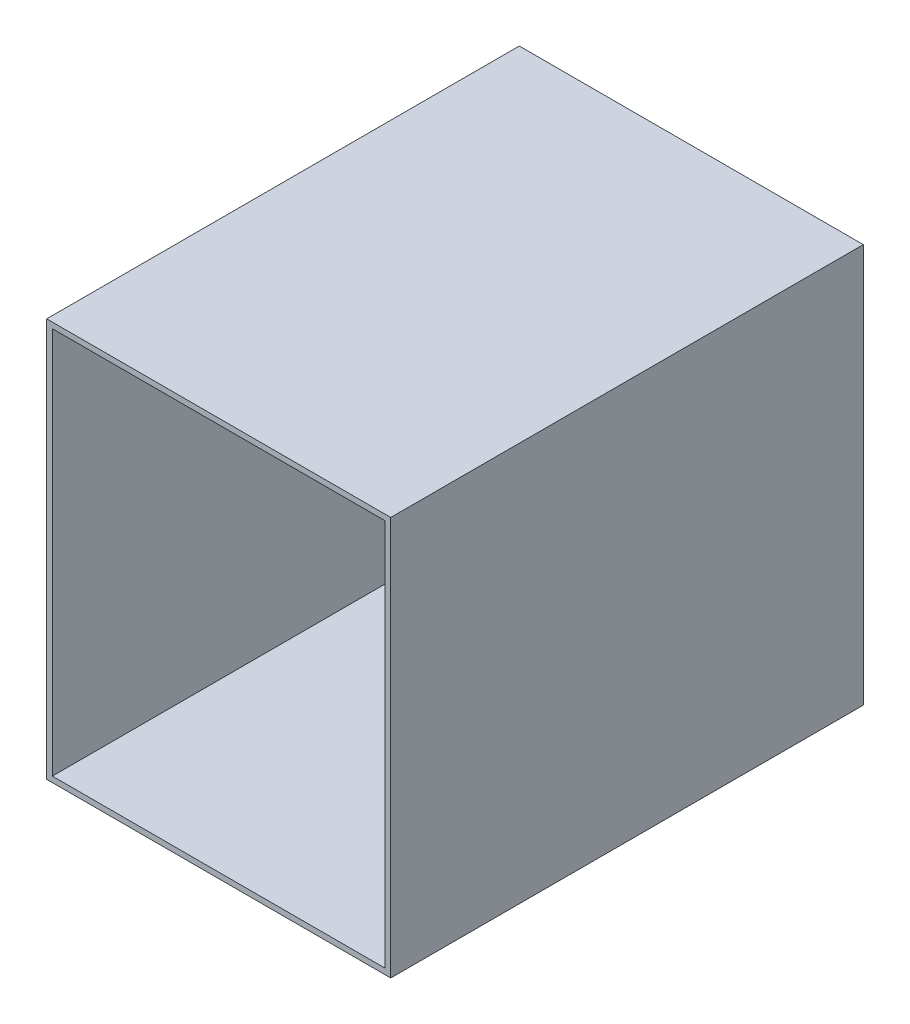
ISO-10303-21;
HEADER;
FILE_DESCRIPTION(('STEP AP214'),'2;1');
FILE_NAME('part.step','',(''),(''),'','','');
FILE_SCHEMA(('AUTOMOTIVE_DESIGN { 1 0 10303 214 1 1 1 1 }'));
ENDSEC;
DATA;
#1=APPLICATION_CONTEXT('core data for automotive mechanical design processes');
#2=APPLICATION_PROTOCOL_DEFINITION('international standard','automotive_design',2000,#1);
#3=PRODUCT_CONTEXT('',#1,'mechanical');
#4=PRODUCT('Part','Part','',(#3));
#5=PRODUCT_RELATED_PRODUCT_CATEGORY('part','',(#4));
#6=PRODUCT_DEFINITION_FORMATION('','',#4);
#7=PRODUCT_DEFINITION_CONTEXT('part definition',#1,'design');
#8=PRODUCT_DEFINITION('design','',#6,#7);
#9=PRODUCT_DEFINITION_SHAPE('','',#8);
#10=(LENGTH_UNIT() NAMED_UNIT(*) SI_UNIT(.MILLI.,.METRE.));
#11=(NAMED_UNIT(*) PLANE_ANGLE_UNIT() SI_UNIT($,.RADIAN.));
#12=(NAMED_UNIT(*) SI_UNIT($,.STERADIAN.) SOLID_ANGLE_UNIT());
#13=UNCERTAINTY_MEASURE_WITH_UNIT(LENGTH_MEASURE(1.E-05),#10,'distance_accuracy_value','');
#14=(GEOMETRIC_REPRESENTATION_CONTEXT(3) GLOBAL_UNCERTAINTY_ASSIGNED_CONTEXT((#13)) GLOBAL_UNIT_ASSIGNED_CONTEXT((#10,
#11,#12)) REPRESENTATION_CONTEXT('',''));
#15=CARTESIAN_POINT('',(0.,0.,0.));
#16=DIRECTION('',(0.,0.,1.));
#17=DIRECTION('',(1.,0.,0.));
#18=AXIS2_PLACEMENT_3D('',#15,#16,#17);
#19=CARTESIAN_POINT('',(0.,211.,250.));
#20=DIRECTION('',(1.,0.,0.));
#21=DIRECTION('',(0.,0.,-1.));
#22=AXIS2_PLACEMENT_3D('',#19,#20,#21);
#23=PLANE('',#22);
#24=DIRECTION('',(0.,-1.,0.));
#25=VECTOR('',#24,1.);
#26=CARTESIAN_POINT('',(0.,211.,0.));
#27=LINE('',#26,#25);
#28=CARTESIAN_POINT('',(0.,211.,0.));
#29=VERTEX_POINT('',#28);
#30=CARTESIAN_POINT('',(0.,0.,0.));
#31=VERTEX_POINT('',#30);
#32=EDGE_CURVE('E153',#29,#31,#27,.T.);
#33=ORIENTED_EDGE('',*,*,#32,.T.);
#34=DIRECTION('',(0.,0.,-1.));
#35=VECTOR('',#34,1.);
#36=CARTESIAN_POINT('',(0.,0.,250.));
#37=LINE('',#36,#35);
#38=CARTESIAN_POINT('',(0.,0.,250.));
#39=VERTEX_POINT('',#38);
#40=EDGE_CURVE('E11',#39,#31,#37,.T.);
#41=ORIENTED_EDGE('',*,*,#40,.F.);
#42=DIRECTION('',(0.,-1.,0.));
#43=VECTOR('',#42,1.);
#44=CARTESIAN_POINT('',(0.,211.,250.));
#45=LINE('',#44,#43);
#46=CARTESIAN_POINT('',(0.,211.,250.));
#47=VERTEX_POINT('',#46);
#48=EDGE_CURVE('E146',#47,#39,#45,.T.);
#49=ORIENTED_EDGE('',*,*,#48,.F.);
#50=DIRECTION('',(0.,0.,-1.));
#51=VECTOR('',#50,1.);
#52=CARTESIAN_POINT('',(0.,211.,250.));
#53=LINE('',#52,#51);
#54=EDGE_CURVE('E152',#47,#29,#53,.T.);
#55=ORIENTED_EDGE('',*,*,#54,.T.);
#56=EDGE_LOOP('',(#33,#41,#49,#55));
#57=FACE_BOUND('',#56,.T.);
#58=ADVANCED_FACE('F39',(#57),#23,.F.);
#59=CARTESIAN_POINT('',(0.,0.,250.));
#60=DIRECTION('',(0.,1.,0.));
#61=DIRECTION('',(0.,0.,1.));
#62=AXIS2_PLACEMENT_3D('',#59,#60,#61);
#63=PLANE('',#62);
#64=DIRECTION('',(1.,0.,0.));
#65=VECTOR('',#64,1.);
#66=CARTESIAN_POINT('',(0.,0.,0.));
#67=LINE('',#66,#65);
#68=CARTESIAN_POINT('',(182.,0.,0.));
#69=VERTEX_POINT('',#68);
#70=EDGE_CURVE('E156',#31,#69,#67,.T.);
#71=ORIENTED_EDGE('',*,*,#70,.T.);
#72=DIRECTION('',(0.,0.,-1.));
#73=VECTOR('',#72,1.);
#74=CARTESIAN_POINT('',(182.,0.,250.));
#75=LINE('',#74,#73);
#76=CARTESIAN_POINT('',(182.,0.,250.));
#77=VERTEX_POINT('',#76);
#78=EDGE_CURVE('E46',#77,#69,#75,.T.);
#79=ORIENTED_EDGE('',*,*,#78,.F.);
#80=DIRECTION('',(1.,0.,0.));
#81=VECTOR('',#80,1.);
#82=CARTESIAN_POINT('',(0.,0.,250.));
#83=LINE('',#82,#81);
#84=EDGE_CURVE('E90',#39,#77,#83,.T.);
#85=ORIENTED_EDGE('',*,*,#84,.F.);
#86=ORIENTED_EDGE('',*,*,#40,.T.);
#87=EDGE_LOOP('',(#71,#79,#85,#86));
#88=FACE_BOUND('',#87,.T.);
#89=ADVANCED_FACE('F185',(#88),#63,.F.);
#90=CARTESIAN_POINT('',(182.,0.,250.));
#91=DIRECTION('',(-1.,0.,0.));
#92=DIRECTION('',(0.,0.,1.));
#93=AXIS2_PLACEMENT_3D('',#90,#91,#92);
#94=PLANE('',#93);
#95=DIRECTION('',(0.,1.,0.));
#96=VECTOR('',#95,1.);
#97=CARTESIAN_POINT('',(182.,0.,0.));
#98=LINE('',#97,#96);
#99=CARTESIAN_POINT('',(182.,211.,0.));
#100=VERTEX_POINT('',#99);
#101=EDGE_CURVE('E158',#69,#100,#98,.T.);
#102=ORIENTED_EDGE('',*,*,#101,.T.);
#103=DIRECTION('',(0.,0.,-1.));
#104=VECTOR('',#103,1.);
#105=CARTESIAN_POINT('',(182.,211.,250.));
#106=LINE('',#105,#104);
#107=CARTESIAN_POINT('',(182.,211.,250.));
#108=VERTEX_POINT('',#107);
#109=EDGE_CURVE('E162',#108,#100,#106,.T.);
#110=ORIENTED_EDGE('',*,*,#109,.F.);
#111=DIRECTION('',(0.,1.,0.));
#112=VECTOR('',#111,1.);
#113=CARTESIAN_POINT('',(182.,0.,250.));
#114=LINE('',#113,#112);
#115=EDGE_CURVE('E149',#77,#108,#114,.T.);
#116=ORIENTED_EDGE('',*,*,#115,.F.);
#117=ORIENTED_EDGE('',*,*,#78,.T.);
#118=EDGE_LOOP('',(#102,#110,#116,#117));
#119=FACE_BOUND('',#118,.T.);
#120=ADVANCED_FACE('F167',(#119),#94,.F.);
#121=CARTESIAN_POINT('',(182.,211.,250.));
#122=DIRECTION('',(0.,-1.,0.));
#123=DIRECTION('',(0.,0.,-1.));
#124=AXIS2_PLACEMENT_3D('',#121,#122,#123);
#125=PLANE('',#124);
#126=DIRECTION('',(-1.,0.,0.));
#127=VECTOR('',#126,1.);
#128=CARTESIAN_POINT('',(182.,211.,0.));
#129=LINE('',#128,#127);
#130=EDGE_CURVE('E83',#100,#29,#129,.T.);
#131=ORIENTED_EDGE('',*,*,#130,.T.);
#132=ORIENTED_EDGE('',*,*,#54,.F.);
#133=DIRECTION('',(-1.,0.,0.));
#134=VECTOR('',#133,1.);
#135=CARTESIAN_POINT('',(182.,211.,250.));
#136=LINE('',#135,#134);
#137=EDGE_CURVE('E62',#108,#47,#136,.T.);
#138=ORIENTED_EDGE('',*,*,#137,.F.);
#139=ORIENTED_EDGE('',*,*,#109,.T.);
#140=EDGE_LOOP('',(#131,#132,#138,#139));
#141=FACE_BOUND('',#140,.T.);
#142=ADVANCED_FACE('F175',(#141),#125,.F.);
#143=CARTESIAN_POINT('',(0.,0.,250.));
#144=DIRECTION('',(0.,0.,1.));
#145=DIRECTION('',(1.,0.,0.));
#146=AXIS2_PLACEMENT_3D('',#143,#144,#145);
#147=PLANE('',#146);
#148=DIRECTION('',(0.,-1.,0.));
#149=VECTOR('',#148,1.);
#150=CARTESIAN_POINT('',(3.,211.,250.));
#151=LINE('',#150,#149);
#152=CARTESIAN_POINT('',(3.,208.,250.));
#153=VERTEX_POINT('',#152);
#154=CARTESIAN_POINT('',(3.,3.,250.));
#155=VERTEX_POINT('',#154);
#156=EDGE_CURVE('E135',#153,#155,#151,.T.);
#157=ORIENTED_EDGE('',*,*,#156,.F.);
#158=DIRECTION('',(-1.,0.,0.));
#159=VECTOR('',#158,1.);
#160=CARTESIAN_POINT('',(182.,208.,250.));
#161=LINE('',#160,#159);
#162=CARTESIAN_POINT('',(179.,208.,250.));
#163=VERTEX_POINT('',#162);
#164=EDGE_CURVE('E144',#163,#153,#161,.T.);
#165=ORIENTED_EDGE('',*,*,#164,.F.);
#166=DIRECTION('',(0.,1.,0.));
#167=VECTOR('',#166,1.);
#168=CARTESIAN_POINT('',(179.,0.,250.));
#169=LINE('',#168,#167);
#170=CARTESIAN_POINT('',(179.,3.,250.));
#171=VERTEX_POINT('',#170);
#172=EDGE_CURVE('E142',#171,#163,#169,.T.);
#173=ORIENTED_EDGE('',*,*,#172,.F.);
#174=DIRECTION('',(1.,0.,0.));
#175=VECTOR('',#174,1.);
#176=CARTESIAN_POINT('',(0.,3.,250.));
#177=LINE('',#176,#175);
#178=EDGE_CURVE('E127',#155,#171,#177,.T.);
#179=ORIENTED_EDGE('',*,*,#178,.F.);
#180=EDGE_LOOP('',(#157,#165,#173,#179));
#181=FACE_BOUND('',#180,.T.);
#182=ORIENTED_EDGE('',*,*,#48,.T.);
#183=ORIENTED_EDGE('',*,*,#84,.T.);
#184=ORIENTED_EDGE('',*,*,#115,.T.);
#185=ORIENTED_EDGE('',*,*,#137,.T.);
#186=EDGE_LOOP('',(#182,#183,#184,#185));
#187=FACE_BOUND('',#186,.T.);
#188=ADVANCED_FACE('F177',(#181,#187),#147,.T.);
#189=CARTESIAN_POINT('',(0.,0.,0.));
#190=DIRECTION('',(0.,0.,1.));
#191=DIRECTION('',(1.,0.,0.));
#192=AXIS2_PLACEMENT_3D('',#189,#190,#191);
#193=PLANE('',#192);
#194=ORIENTED_EDGE('',*,*,#32,.F.);
#195=ORIENTED_EDGE('',*,*,#130,.F.);
#196=ORIENTED_EDGE('',*,*,#101,.F.);
#197=ORIENTED_EDGE('',*,*,#70,.F.);
#198=EDGE_LOOP('',(#194,#195,#196,#197));
#199=FACE_BOUND('',#198,.T.);
#200=ADVANCED_FACE('F171',(#199),#193,.F.);
#201=CARTESIAN_POINT('',(3.,211.,250.));
#202=DIRECTION('',(1.,0.,0.));
#203=DIRECTION('',(0.,0.,-1.));
#204=AXIS2_PLACEMENT_3D('',#201,#202,#203);
#205=PLANE('',#204);
#206=DIRECTION('',(0.,-1.,0.));
#207=VECTOR('',#206,1.);
#208=CARTESIAN_POINT('',(3.,211.,3.));
#209=LINE('',#208,#207);
#210=CARTESIAN_POINT('',(3.,208.,3.));
#211=VERTEX_POINT('',#210);
#212=CARTESIAN_POINT('',(3.,3.,3.));
#213=VERTEX_POINT('',#212);
#214=EDGE_CURVE('E118',#211,#213,#209,.T.);
#215=ORIENTED_EDGE('',*,*,#214,.F.);
#216=DIRECTION('',(0.,0.,-1.));
#217=VECTOR('',#216,1.);
#218=CARTESIAN_POINT('',(3.,208.,250.));
#219=LINE('',#218,#217);
#220=EDGE_CURVE('E138',#153,#211,#219,.T.);
#221=ORIENTED_EDGE('',*,*,#220,.F.);
#222=ORIENTED_EDGE('',*,*,#156,.T.);
#223=DIRECTION('',(0.,0.,-1.));
#224=VECTOR('',#223,1.);
#225=CARTESIAN_POINT('',(3.,3.,250.));
#226=LINE('',#225,#224);
#227=EDGE_CURVE('E130',#155,#213,#226,.T.);
#228=ORIENTED_EDGE('',*,*,#227,.T.);
#229=EDGE_LOOP('',(#215,#221,#222,#228));
#230=FACE_BOUND('',#229,.T.);
#231=ADVANCED_FACE('F214',(#230),#205,.T.);
#232=CARTESIAN_POINT('',(0.,3.,250.));
#233=DIRECTION('',(0.,1.,0.));
#234=DIRECTION('',(0.,0.,1.));
#235=AXIS2_PLACEMENT_3D('',#232,#233,#234);
#236=PLANE('',#235);
#237=DIRECTION('',(1.,0.,0.));
#238=VECTOR('',#237,1.);
#239=CARTESIAN_POINT('',(0.,3.,3.));
#240=LINE('',#239,#238);
#241=CARTESIAN_POINT('',(179.,3.,3.));
#242=VERTEX_POINT('',#241);
#243=EDGE_CURVE('E112',#213,#242,#240,.T.);
#244=ORIENTED_EDGE('',*,*,#243,.F.);
#245=ORIENTED_EDGE('',*,*,#227,.F.);
#246=ORIENTED_EDGE('',*,*,#178,.T.);
#247=DIRECTION('',(0.,0.,-1.));
#248=VECTOR('',#247,1.);
#249=CARTESIAN_POINT('',(179.,3.,250.));
#250=LINE('',#249,#248);
#251=EDGE_CURVE('E124',#171,#242,#250,.T.);
#252=ORIENTED_EDGE('',*,*,#251,.T.);
#253=EDGE_LOOP('',(#244,#245,#246,#252));
#254=FACE_BOUND('',#253,.T.);
#255=ADVANCED_FACE('F125',(#254),#236,.T.);
#256=CARTESIAN_POINT('',(179.,0.,250.));
#257=DIRECTION('',(-1.,0.,0.));
#258=DIRECTION('',(0.,0.,1.));
#259=AXIS2_PLACEMENT_3D('',#256,#257,#258);
#260=PLANE('',#259);
#261=DIRECTION('',(0.,1.,0.));
#262=VECTOR('',#261,1.);
#263=CARTESIAN_POINT('',(179.,0.,3.));
#264=LINE('',#263,#262);
#265=CARTESIAN_POINT('',(179.,208.,3.));
#266=VERTEX_POINT('',#265);
#267=EDGE_CURVE('E116',#242,#266,#264,.T.);
#268=ORIENTED_EDGE('',*,*,#267,.F.);
#269=ORIENTED_EDGE('',*,*,#251,.F.);
#270=ORIENTED_EDGE('',*,*,#172,.T.);
#271=DIRECTION('',(0.,0.,-1.));
#272=VECTOR('',#271,1.);
#273=CARTESIAN_POINT('',(179.,208.,250.));
#274=LINE('',#273,#272);
#275=EDGE_CURVE('E53',#163,#266,#274,.T.);
#276=ORIENTED_EDGE('',*,*,#275,.T.);
#277=EDGE_LOOP('',(#268,#269,#270,#276));
#278=FACE_BOUND('',#277,.T.);
#279=ADVANCED_FACE('F132',(#278),#260,.T.);
#280=CARTESIAN_POINT('',(182.,208.,250.));
#281=DIRECTION('',(0.,-1.,0.));
#282=DIRECTION('',(0.,0.,-1.));
#283=AXIS2_PLACEMENT_3D('',#280,#281,#282);
#284=PLANE('',#283);
#285=DIRECTION('',(-1.,0.,0.));
#286=VECTOR('',#285,1.);
#287=CARTESIAN_POINT('',(182.,208.,3.));
#288=LINE('',#287,#286);
#289=EDGE_CURVE('E133',#266,#211,#288,.T.);
#290=ORIENTED_EDGE('',*,*,#289,.F.);
#291=ORIENTED_EDGE('',*,*,#275,.F.);
#292=ORIENTED_EDGE('',*,*,#164,.T.);
#293=ORIENTED_EDGE('',*,*,#220,.T.);
#294=EDGE_LOOP('',(#290,#291,#292,#293));
#295=FACE_BOUND('',#294,.T.);
#296=ADVANCED_FACE('F248',(#295),#284,.T.);
#297=CARTESIAN_POINT('',(0.,0.,3.));
#298=DIRECTION('',(0.,0.,1.));
#299=DIRECTION('',(1.,0.,0.));
#300=AXIS2_PLACEMENT_3D('',#297,#298,#299);
#301=PLANE('',#300);
#302=ORIENTED_EDGE('',*,*,#214,.T.);
#303=ORIENTED_EDGE('',*,*,#243,.T.);
#304=ORIENTED_EDGE('',*,*,#267,.T.);
#305=ORIENTED_EDGE('',*,*,#289,.T.);
#306=EDGE_LOOP('',(#302,#303,#304,#305));
#307=FACE_BOUND('',#306,.T.);
#308=ADVANCED_FACE('F114',(#307),#301,.T.);
#309=CLOSED_SHELL('',(#58,#89,#120,#142,#188,#200,#231,#255,#279,#296,#308));
#310=MANIFOLD_SOLID_BREP('B2',#309);
#311=ADVANCED_BREP_SHAPE_REPRESENTATION('',(#18,#310),#14);
#312=SHAPE_DEFINITION_REPRESENTATION(#9,#311);
ENDSEC;
END-ISO-10303-21;
